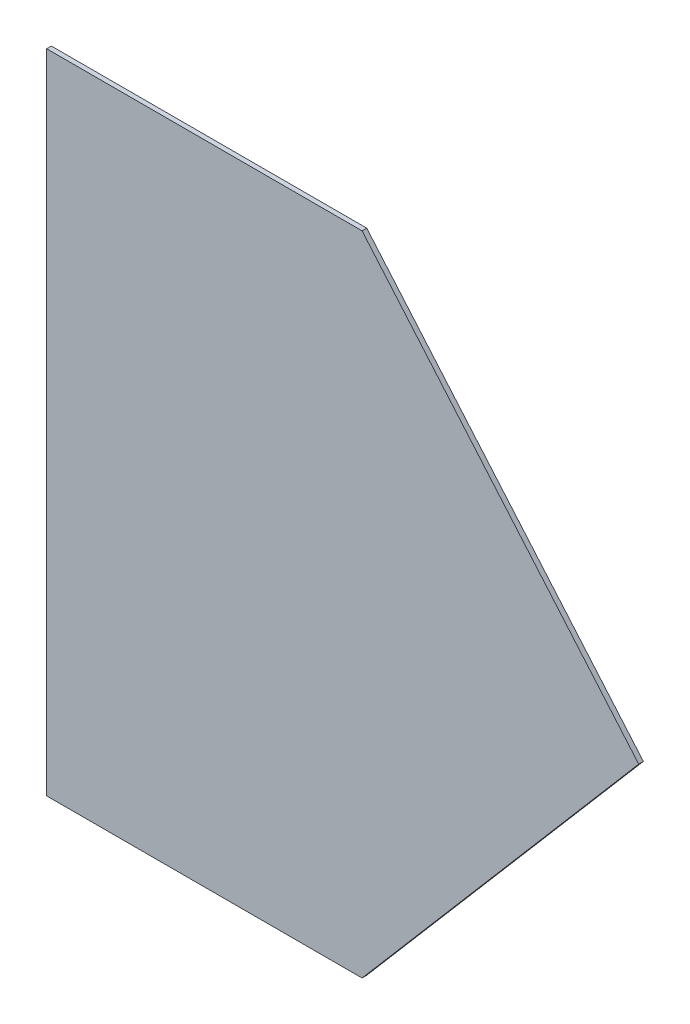
ISO-10303-21;
HEADER;
FILE_DESCRIPTION(('STEP AP214'),'2;1');
FILE_NAME('part.step','',(''),(''),'','','');
FILE_SCHEMA(('AUTOMOTIVE_DESIGN { 1 0 10303 214 1 1 1 1 }'));
ENDSEC;
DATA;
#1=APPLICATION_CONTEXT('core data for automotive mechanical design processes');
#2=APPLICATION_PROTOCOL_DEFINITION('international standard','automotive_design',2000,#1);
#3=PRODUCT_CONTEXT('',#1,'mechanical');
#4=PRODUCT('Part','Part','',(#3));
#5=PRODUCT_RELATED_PRODUCT_CATEGORY('part','',(#4));
#6=PRODUCT_DEFINITION_FORMATION('','',#4);
#7=PRODUCT_DEFINITION_CONTEXT('part definition',#1,'design');
#8=PRODUCT_DEFINITION('design','',#6,#7);
#9=PRODUCT_DEFINITION_SHAPE('','',#8);
#10=(LENGTH_UNIT() NAMED_UNIT(*) SI_UNIT(.MILLI.,.METRE.));
#11=(NAMED_UNIT(*) PLANE_ANGLE_UNIT() SI_UNIT($,.RADIAN.));
#12=(NAMED_UNIT(*) SI_UNIT($,.STERADIAN.) SOLID_ANGLE_UNIT());
#13=UNCERTAINTY_MEASURE_WITH_UNIT(LENGTH_MEASURE(1.E-05),#10,'distance_accuracy_value','');
#14=(GEOMETRIC_REPRESENTATION_CONTEXT(3) GLOBAL_UNCERTAINTY_ASSIGNED_CONTEXT((#13)) GLOBAL_UNIT_ASSIGNED_CONTEXT((#10,
#11,#12)) REPRESENTATION_CONTEXT('',''));
#15=CARTESIAN_POINT('',(0.,0.,0.));
#16=DIRECTION('',(0.,0.,1.));
#17=DIRECTION('',(1.,0.,0.));
#18=AXIS2_PLACEMENT_3D('',#15,#16,#17);
#19=CARTESIAN_POINT('',(0.,0.702750384953815,1.349));
#20=DIRECTION('',(-1.,0.,0.));
#21=DIRECTION('',(0.,-1.,0.));
#22=AXIS2_PLACEMENT_3D('',#19,#20,#21);
#23=PLANE('',#22);
#24=DIRECTION('',(0.,-1.,0.));
#25=VECTOR('',#24,1.);
#26=CARTESIAN_POINT('',(0.,0.,1.36));
#27=LINE('',#26,#25);
#28=CARTESIAN_POINT('',(0.,0.692750384953815,1.36));
#29=VERTEX_POINT('',#28);
#30=CARTESIAN_POINT('',(0.,-0.692750384953815,1.36));
#31=VERTEX_POINT('',#30);
#32=EDGE_CURVE('E74',#29,#31,#27,.T.);
#33=ORIENTED_EDGE('',*,*,#32,.F.);
#34=DIRECTION('',(0.,0.,-1.));
#35=VECTOR('',#34,1.);
#36=CARTESIAN_POINT('',(0.,0.692750384953815,1.355));
#37=LINE('',#36,#35);
#38=CARTESIAN_POINT('',(0.,0.692750384953815,1.35));
#39=VERTEX_POINT('',#38);
#40=EDGE_CURVE('E101',#29,#39,#37,.T.);
#41=ORIENTED_EDGE('',*,*,#40,.T.);
#42=DIRECTION('',(0.,1.,0.));
#43=VECTOR('',#42,1.);
#44=CARTESIAN_POINT('',(0.,0.,1.35));
#45=LINE('',#44,#43);
#46=CARTESIAN_POINT('',(0.,-0.692750384953815,1.35));
#47=VERTEX_POINT('',#46);
#48=EDGE_CURVE('E97',#47,#39,#45,.T.);
#49=ORIENTED_EDGE('',*,*,#48,.F.);
#50=DIRECTION('',(0.,0.,-1.));
#51=VECTOR('',#50,1.);
#52=CARTESIAN_POINT('',(0.,-0.692750384953815,1.355));
#53=LINE('',#52,#51);
#54=EDGE_CURVE('E100',#31,#47,#53,.T.);
#55=ORIENTED_EDGE('',*,*,#54,.F.);
#56=EDGE_LOOP('',(#33,#41,#49,#55));
#57=FACE_BOUND('',#56,.T.);
#58=ADVANCED_FACE('F16',(#57),#23,.T.);
#59=CARTESIAN_POINT('',(-0.01,-0.692750384953815,1.349));
#60=DIRECTION('',(0.,-1.,0.));
#61=DIRECTION('',(1.,0.,0.));
#62=AXIS2_PLACEMENT_3D('',#59,#60,#61);
#63=PLANE('',#62);
#64=DIRECTION('',(1.,0.,0.));
#65=VECTOR('',#64,1.);
#66=CARTESIAN_POINT('',(0.633875192476905,-0.692750384953815,1.36));
#67=LINE('',#66,#65);
#68=CARTESIAN_POINT('',(0.675394165895255,-0.692750384953815,1.36));
#69=VERTEX_POINT('',#68);
#70=EDGE_CURVE('E67',#31,#69,#67,.T.);
#71=ORIENTED_EDGE('',*,*,#70,.F.);
#72=ORIENTED_EDGE('',*,*,#54,.T.);
#73=DIRECTION('',(-1.,0.,0.));
#74=VECTOR('',#73,1.);
#75=CARTESIAN_POINT('',(0.633875192476905,-0.692750384953815,1.35));
#76=LINE('',#75,#74);
#77=CARTESIAN_POINT('',(0.675394165895255,-0.692750384953815,1.35));
#78=VERTEX_POINT('',#77);
#79=EDGE_CURVE('E70',#78,#47,#76,.T.);
#80=ORIENTED_EDGE('',*,*,#79,.F.);
#81=DIRECTION('',(0.,0.,-1.));
#82=VECTOR('',#81,1.);
#83=CARTESIAN_POINT('',(0.675394165895255,-0.692750384953815,1.355));
#84=LINE('',#83,#82);
#85=EDGE_CURVE('E62',#69,#78,#84,.T.);
#86=ORIENTED_EDGE('',*,*,#85,.F.);
#87=EDGE_LOOP('',(#71,#72,#80,#86));
#88=FACE_BOUND('',#87,.T.);
#89=ADVANCED_FACE('F64',(#88),#63,.T.);
#90=CARTESIAN_POINT('',(1.27775038495381,-0.702750384953815,1.35));
#91=DIRECTION('',(0.,0.,-1.));
#92=DIRECTION('',(-1.,0.,0.));
#93=AXIS2_PLACEMENT_3D('',#90,#91,#92);
#94=PLANE('',#93);
#95=DIRECTION('',(0.649886607273505,0.760031182048824,0.));
#96=VECTOR('',#95,1.);
#97=CARTESIAN_POINT('',(0.971572275424535,-0.346375192476908,1.35));
#98=LINE('',#97,#96);
#99=CARTESIAN_POINT('',(1.26775038330914,1.92341182221853E-09,1.35));
#100=VERTEX_POINT('',#99);
#101=EDGE_CURVE('E75',#78,#100,#98,.T.);
#102=ORIENTED_EDGE('',*,*,#101,.F.);
#103=ORIENTED_EDGE('',*,*,#79,.T.);
#104=ORIENTED_EDGE('',*,*,#48,.T.);
#105=DIRECTION('',(1.,0.,0.));
#106=VECTOR('',#105,1.);
#107=CARTESIAN_POINT('',(0.633875192476905,0.692750384953815,1.35));
#108=LINE('',#107,#106);
#109=CARTESIAN_POINT('',(0.675394165895255,0.692750384953814,1.35));
#110=VERTEX_POINT('',#109);
#111=EDGE_CURVE('E95',#39,#110,#108,.T.);
#112=ORIENTED_EDGE('',*,*,#111,.T.);
#113=DIRECTION('',(-0.649886607273505,0.760031182048824,0.));
#114=VECTOR('',#113,1.);
#115=CARTESIAN_POINT('',(0.971572275424535,0.346375192476907,1.35));
#116=LINE('',#115,#114);
#117=EDGE_CURVE('E81',#100,#110,#116,.T.);
#118=ORIENTED_EDGE('',*,*,#117,.F.);
#119=EDGE_LOOP('',(#102,#103,#104,#112,#118));
#120=FACE_BOUND('',#119,.T.);
#121=ADVANCED_FACE('F107',(#120),#94,.T.);
#122=CARTESIAN_POINT('',(0.66889529982252,-0.700350696774303,1.349));
#123=DIRECTION('',(0.760031182048824,-0.649886607273505,0.));
#124=DIRECTION('',(0.649886607273505,0.760031182048824,0.));
#125=AXIS2_PLACEMENT_3D('',#122,#123,#124);
#126=PLANE('',#125);
#127=DIRECTION('',(0.649886607273502,0.760031182048827,0.));
#128=VECTOR('',#127,1.);
#129=CARTESIAN_POINT('',(0.675394165895255,-0.692750384953815,1.36));
#130=LINE('',#129,#128);
#131=CARTESIAN_POINT('',(1.26775038495381,0.,1.36));
#132=VERTEX_POINT('',#131);
#133=EDGE_CURVE('E20',#69,#132,#130,.T.);
#134=ORIENTED_EDGE('',*,*,#133,.F.);
#135=ORIENTED_EDGE('',*,*,#85,.T.);
#136=ORIENTED_EDGE('',*,*,#101,.T.);
#137=DIRECTION('',(0.,0.,-1.));
#138=VECTOR('',#137,1.);
#139=CARTESIAN_POINT('',(1.26775038495381,0.,1.355));
#140=LINE('',#139,#138);
#141=EDGE_CURVE('E80',#132,#100,#140,.T.);
#142=ORIENTED_EDGE('',*,*,#141,.F.);
#143=EDGE_LOOP('',(#134,#135,#136,#142));
#144=FACE_BOUND('',#143,.T.);
#145=ADVANCED_FACE('F78',(#144),#126,.T.);
#146=CARTESIAN_POINT('',(-0.01,-0.702750384953815,1.36));
#147=DIRECTION('',(0.,0.,1.));
#148=DIRECTION('',(1.,0.,0.));
#149=AXIS2_PLACEMENT_3D('',#146,#147,#148);
#150=PLANE('',#149);
#151=DIRECTION('',(0.649886607273505,-0.760031182048824,0.));
#152=VECTOR('',#151,1.);
#153=CARTESIAN_POINT('',(0.971572275424535,0.346375192476907,1.36));
#154=LINE('',#153,#152);
#155=CARTESIAN_POINT('',(0.675394165895255,0.692750384953814,1.36));
#156=VERTEX_POINT('',#155);
#157=EDGE_CURVE('E35',#156,#132,#154,.T.);
#158=ORIENTED_EDGE('',*,*,#157,.F.);
#159=DIRECTION('',(1.,0.,0.));
#160=VECTOR('',#159,1.);
#161=CARTESIAN_POINT('',(0.337697082947627,0.692750384953815,1.36));
#162=LINE('',#161,#160);
#163=EDGE_CURVE('E26',#29,#156,#162,.T.);
#164=ORIENTED_EDGE('',*,*,#163,.F.);
#165=ORIENTED_EDGE('',*,*,#32,.T.);
#166=ORIENTED_EDGE('',*,*,#70,.T.);
#167=ORIENTED_EDGE('',*,*,#133,.T.);
#168=EDGE_LOOP('',(#158,#164,#165,#166,#167));
#169=FACE_BOUND('',#168,.T.);
#170=ADVANCED_FACE('F82',(#169),#150,.T.);
#171=CARTESIAN_POINT('',(1.27424925102655,-0.00760031182048882,1.349));
#172=DIRECTION('',(0.760031182048824,0.649886607273505,0.));
#173=DIRECTION('',(-0.649886607273505,0.760031182048824,0.));
#174=AXIS2_PLACEMENT_3D('',#171,#172,#173);
#175=PLANE('',#174);
#176=ORIENTED_EDGE('',*,*,#157,.T.);
#177=ORIENTED_EDGE('',*,*,#141,.T.);
#178=ORIENTED_EDGE('',*,*,#117,.T.);
#179=DIRECTION('',(0.,0.,-1.));
#180=VECTOR('',#179,1.);
#181=CARTESIAN_POINT('',(0.675394165895255,0.692750384953814,1.355));
#182=LINE('',#181,#180);
#183=EDGE_CURVE('E11',#156,#110,#182,.T.);
#184=ORIENTED_EDGE('',*,*,#183,.F.);
#185=EDGE_LOOP('',(#176,#177,#178,#184));
#186=FACE_BOUND('',#185,.T.);
#187=ADVANCED_FACE('F108',(#186),#175,.T.);
#188=CARTESIAN_POINT('',(0.685394165895255,0.692750384953814,1.349));
#189=DIRECTION('',(0.,1.,0.));
#190=DIRECTION('',(-1.,0.,0.));
#191=AXIS2_PLACEMENT_3D('',#188,#189,#190);
#192=PLANE('',#191);
#193=ORIENTED_EDGE('',*,*,#163,.T.);
#194=ORIENTED_EDGE('',*,*,#183,.T.);
#195=ORIENTED_EDGE('',*,*,#111,.F.);
#196=ORIENTED_EDGE('',*,*,#40,.F.);
#197=EDGE_LOOP('',(#193,#194,#195,#196));
#198=FACE_BOUND('',#197,.T.);
#199=ADVANCED_FACE('F18',(#198),#192,.T.);
#200=CLOSED_SHELL('',(#58,#89,#121,#145,#170,#187,#199));
#201=MANIFOLD_SOLID_BREP('B1',#200);
#202=ADVANCED_BREP_SHAPE_REPRESENTATION('',(#18,#201),#14);
#203=SHAPE_DEFINITION_REPRESENTATION(#9,#202);
ENDSEC;
END-ISO-10303-21;
